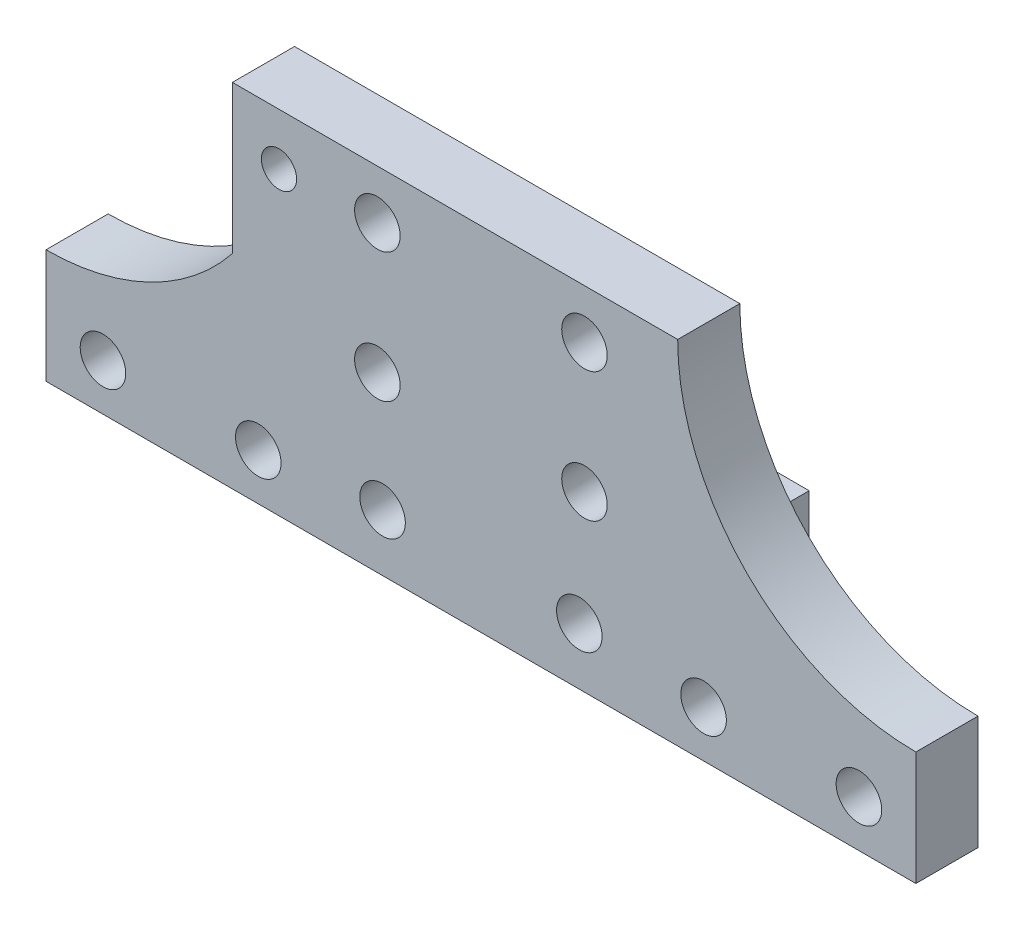
ISO-10303-21;
HEADER;
FILE_DESCRIPTION(('STEP AP214'),'2;1');
FILE_NAME('part.step','',(''),(''),'','','');
FILE_SCHEMA(('AUTOMOTIVE_DESIGN { 1 0 10303 214 1 1 1 1 }'));
ENDSEC;
DATA;
#1=APPLICATION_CONTEXT('core data for automotive mechanical design processes');
#2=APPLICATION_PROTOCOL_DEFINITION('international standard','automotive_design',2000,#1);
#3=PRODUCT_CONTEXT('',#1,'mechanical');
#4=PRODUCT('Part','Part','',(#3));
#5=PRODUCT_RELATED_PRODUCT_CATEGORY('part','',(#4));
#6=PRODUCT_DEFINITION_FORMATION('','',#4);
#7=PRODUCT_DEFINITION_CONTEXT('part definition',#1,'design');
#8=PRODUCT_DEFINITION('design','',#6,#7);
#9=PRODUCT_DEFINITION_SHAPE('','',#8);
#10=(LENGTH_UNIT() NAMED_UNIT(*) SI_UNIT(.MILLI.,.METRE.));
#11=(NAMED_UNIT(*) PLANE_ANGLE_UNIT() SI_UNIT($,.RADIAN.));
#12=(NAMED_UNIT(*) SI_UNIT($,.STERADIAN.) SOLID_ANGLE_UNIT());
#13=UNCERTAINTY_MEASURE_WITH_UNIT(LENGTH_MEASURE(1.E-05),#10,'distance_accuracy_value','');
#14=(GEOMETRIC_REPRESENTATION_CONTEXT(3) GLOBAL_UNCERTAINTY_ASSIGNED_CONTEXT((#13)) GLOBAL_UNIT_ASSIGNED_CONTEXT((#10,
#11,#12)) REPRESENTATION_CONTEXT('',''));
#15=CARTESIAN_POINT('',(0.,0.,0.));
#16=DIRECTION('',(0.,0.,1.));
#17=DIRECTION('',(1.,0.,0.));
#18=AXIS2_PLACEMENT_3D('',#15,#16,#17);
#19=CARTESIAN_POINT('',(15.5,29.5,-14.3));
#20=DIRECTION('',(0.,0.,-1.));
#21=DIRECTION('',(-1.,0.,0.));
#22=AXIS2_PLACEMENT_3D('',#19,#20,#21);
#23=PLANE('',#22);
#24=CARTESIAN_POINT('',(-16.4999999999999,12.25,-14.3));
#25=DIRECTION('',(0.,0.,-1.));
#26=DIRECTION('',(-1.,0.,0.));
#27=AXIS2_PLACEMENT_3D('',#24,#25,#26);
#28=CIRCLE('',#27,2.20000000000001);
#29=CARTESIAN_POINT('',(-18.6999999999999,12.25,-14.3));
#30=VERTEX_POINT('',#29);
#31=EDGE_CURVE('E233',#30,#30,#28,.T.);
#32=ORIENTED_EDGE('',*,*,#31,.F.);
#33=EDGE_LOOP('',(#32));
#34=FACE_BOUND('',#33,.T.);
#35=CARTESIAN_POINT('',(-16.4999999999999,24.75,-14.3));
#36=DIRECTION('',(0.,0.,-1.));
#37=DIRECTION('',(-1.,0.,0.));
#38=AXIS2_PLACEMENT_3D('',#35,#36,#37);
#39=CIRCLE('',#38,2.20000000000001);
#40=CARTESIAN_POINT('',(-18.6999999999999,24.75,-14.3));
#41=VERTEX_POINT('',#40);
#42=EDGE_CURVE('E215',#41,#41,#39,.T.);
#43=ORIENTED_EDGE('',*,*,#42,.F.);
#44=EDGE_LOOP('',(#43));
#45=FACE_BOUND('',#44,.T.);
#46=CARTESIAN_POINT('',(-5.,0.,-14.3));
#47=DIRECTION('',(0.,0.,-1.));
#48=DIRECTION('',(-1.,0.,0.));
#49=AXIS2_PLACEMENT_3D('',#46,#47,#48);
#50=CIRCLE('',#49,2.20000000000001);
#51=CARTESIAN_POINT('',(-7.20000000000002,0.,-14.3));
#52=VERTEX_POINT('',#51);
#53=EDGE_CURVE('E187',#52,#52,#50,.T.);
#54=ORIENTED_EDGE('',*,*,#53,.F.);
#55=EDGE_LOOP('',(#54));
#56=FACE_BOUND('',#55,.T.);
#57=CARTESIAN_POINT('',(9.99999999999999,0.,-14.3));
#58=DIRECTION('',(0.,0.,-1.));
#59=DIRECTION('',(-1.,0.,0.));
#60=AXIS2_PLACEMENT_3D('',#57,#58,#59);
#61=CIRCLE('',#60,2.20000000000001);
#62=CARTESIAN_POINT('',(7.79999999999997,0.,-14.3));
#63=VERTEX_POINT('',#62);
#64=EDGE_CURVE('E181',#63,#63,#61,.T.);
#65=ORIENTED_EDGE('',*,*,#64,.F.);
#66=EDGE_LOOP('',(#65));
#67=FACE_BOUND('',#66,.T.);
#68=DIRECTION('',(1.,0.,0.));
#69=VECTOR('',#68,1.);
#70=CARTESIAN_POINT('',(-11.4999999999999,6.5,-14.3));
#71=LINE('',#70,#69);
#72=CARTESIAN_POINT('',(-23.9999999999998,6.5,-14.3));
#73=VERTEX_POINT('',#72);
#74=CARTESIAN_POINT('',(-11.4999999999999,6.5,-14.3));
#75=VERTEX_POINT('',#74);
#76=EDGE_CURVE('E292',#73,#75,#71,.T.);
#77=ORIENTED_EDGE('',*,*,#76,.F.);
#78=DIRECTION('',(0.,1.,0.));
#79=VECTOR('',#78,1.);
#80=CARTESIAN_POINT('',(-23.9999999999998,29.5,-14.3));
#81=LINE('',#80,#79);
#82=CARTESIAN_POINT('',(-23.9999999999998,29.5,-14.3));
#83=VERTEX_POINT('',#82);
#84=EDGE_CURVE('E45',#73,#83,#81,.T.);
#85=ORIENTED_EDGE('',*,*,#84,.T.);
#86=DIRECTION('',(1.,0.,0.));
#87=VECTOR('',#86,1.);
#88=CARTESIAN_POINT('',(-68.5,29.5,-14.3));
#89=LINE('',#88,#87);
#90=CARTESIAN_POINT('',(-7.5,29.5,-14.3));
#91=VERTEX_POINT('',#90);
#92=EDGE_CURVE('E350',#83,#91,#89,.T.);
#93=ORIENTED_EDGE('',*,*,#92,.T.);
#94=CARTESIAN_POINT('',(15.5,29.5,-14.3));
#95=DIRECTION('',(0.,0.,-1.));
#96=DIRECTION('',(-1.,0.,0.));
#97=AXIS2_PLACEMENT_3D('',#94,#95,#96);
#98=CIRCLE('',#97,23.);
#99=CARTESIAN_POINT('',(15.5,6.49999999999998,-14.3));
#100=VERTEX_POINT('',#99);
#101=EDGE_CURVE('E240',#100,#91,#98,.T.);
#102=ORIENTED_EDGE('',*,*,#101,.F.);
#103=DIRECTION('',(0.,-1.,0.));
#104=VECTOR('',#103,1.);
#105=CARTESIAN_POINT('',(15.5,29.5,-14.3));
#106=LINE('',#105,#104);
#107=CARTESIAN_POINT('',(15.5,-4.5,-14.3));
#108=VERTEX_POINT('',#107);
#109=EDGE_CURVE('E320',#100,#108,#106,.T.);
#110=ORIENTED_EDGE('',*,*,#109,.T.);
#111=DIRECTION('',(-1.,0.,0.));
#112=VECTOR('',#111,1.);
#113=CARTESIAN_POINT('',(15.5,-4.5,-14.3));
#114=LINE('',#113,#112);
#115=CARTESIAN_POINT('',(-11.4999999999999,-4.5,-14.3));
#116=VERTEX_POINT('',#115);
#117=EDGE_CURVE('E319',#108,#116,#114,.T.);
#118=ORIENTED_EDGE('',*,*,#117,.T.);
#119=DIRECTION('',(0.,-1.,0.));
#120=VECTOR('',#119,1.);
#121=CARTESIAN_POINT('',(-11.4999999999999,-4.5,-14.3));
#122=LINE('',#121,#120);
#123=EDGE_CURVE('E257',#75,#116,#122,.T.);
#124=ORIENTED_EDGE('',*,*,#123,.F.);
#125=EDGE_LOOP('',(#77,#85,#93,#102,#110,#118,#124));
#126=FACE_BOUND('',#125,.T.);
#127=ADVANCED_FACE('F30',(#34,#45,#56,#67,#126),#23,.T.);
#128=CARTESIAN_POINT('',(-11.4999999999999,6.5,-25.0000000000001));
#129=DIRECTION('',(0.,-1.,0.));
#130=DIRECTION('',(0.,0.,-1.));
#131=AXIS2_PLACEMENT_3D('',#128,#129,#130);
#132=PLANE('',#131);
#133=CARTESIAN_POINT('',(-41.5000000000001,6.5,-14.3));
#134=VERTEX_POINT('',#133);
#135=CARTESIAN_POINT('',(-28.9999999999999,6.5,-14.3));
#136=VERTEX_POINT('',#135);
#137=EDGE_CURVE('E262',#134,#136,#71,.T.);
#138=ORIENTED_EDGE('',*,*,#137,.T.);
#139=DIRECTION('',(0.,0.,-1.));
#140=VECTOR('',#139,1.);
#141=CARTESIAN_POINT('',(-28.9999999999999,6.5,-25.0000000000001));
#142=LINE('',#141,#140);
#143=CARTESIAN_POINT('',(-28.9999999999999,6.5,-21.0000000000001));
#144=VERTEX_POINT('',#143);
#145=EDGE_CURVE('E158',#136,#144,#142,.T.);
#146=ORIENTED_EDGE('',*,*,#145,.T.);
#147=DIRECTION('',(1.,0.,0.));
#148=VECTOR('',#147,1.);
#149=CARTESIAN_POINT('',(-11.4999999999999,6.5,-21.0000000000001));
#150=LINE('',#149,#148);
#151=CARTESIAN_POINT('',(-26.4999999999999,6.50000000000001,-21.0000000000001));
#152=VERTEX_POINT('',#151);
#153=EDGE_CURVE('E157',#144,#152,#150,.T.);
#154=ORIENTED_EDGE('',*,*,#153,.T.);
#155=CARTESIAN_POINT('',(-26.4999999999999,6.5,-25.0000000000001));
#156=DIRECTION('',(0.,-1.,0.));
#157=DIRECTION('',(0.,0.,-1.));
#158=AXIS2_PLACEMENT_3D('',#155,#156,#157);
#159=CIRCLE('',#158,4.00000000000001);
#160=CARTESIAN_POINT('',(-30.4999999999999,6.5,-25.0000000000001));
#161=VERTEX_POINT('',#160);
#162=EDGE_CURVE('E179',#152,#161,#159,.T.);
#163=ORIENTED_EDGE('',*,*,#162,.T.);
#164=DIRECTION('',(1.,0.,0.));
#165=VECTOR('',#164,1.);
#166=CARTESIAN_POINT('',(-11.4999999999999,6.5,-25.0000000000001));
#167=LINE('',#166,#165);
#168=CARTESIAN_POINT('',(-41.5000000000001,6.5,-25.0000000000001));
#169=VERTEX_POINT('',#168);
#170=EDGE_CURVE('E269',#169,#161,#167,.T.);
#171=ORIENTED_EDGE('',*,*,#170,.F.);
#172=DIRECTION('',(0.,0.,1.));
#173=VECTOR('',#172,1.);
#174=CARTESIAN_POINT('',(-41.5000000000001,6.5,-25.0000000000001));
#175=LINE('',#174,#173);
#176=EDGE_CURVE('E295',#169,#134,#175,.T.);
#177=ORIENTED_EDGE('',*,*,#176,.T.);
#178=EDGE_LOOP('',(#138,#146,#154,#163,#171,#177));
#179=FACE_BOUND('',#178,.T.);
#180=ADVANCED_FACE('F402',(#179),#132,.F.);
#181=CARTESIAN_POINT('',(-11.4999999999999,6.5,-25.0000000000001));
#182=DIRECTION('',(0.,0.,1.));
#183=DIRECTION('',(1.,0.,0.));
#184=AXIS2_PLACEMENT_3D('',#181,#182,#183);
#185=PLANE('',#184);
#186=CARTESIAN_POINT('',(-35.9999999999999,1.00000000000003,-25.0000000000001));
#187=DIRECTION('',(0.,0.,-1.));
#188=DIRECTION('',(0.,1.,0.));
#189=AXIS2_PLACEMENT_3D('',#186,#187,#188);
#190=CIRCLE('',#189,2.20000000000001);
#191=CARTESIAN_POINT('',(-35.9999999999999,3.20000000000005,-25.0000000000001));
#192=VERTEX_POINT('',#191);
#193=EDGE_CURVE('E209',#192,#192,#190,.T.);
#194=ORIENTED_EDGE('',*,*,#193,.F.);
#195=EDGE_LOOP('',(#194));
#196=FACE_BOUND('',#195,.T.);
#197=ORIENTED_EDGE('',*,*,#170,.T.);
#198=DIRECTION('',(0.,-1.,0.));
#199=VECTOR('',#198,1.);
#200=CARTESIAN_POINT('',(-30.4999999999999,-4.5,-25.0000000000001));
#201=LINE('',#200,#199);
#202=CARTESIAN_POINT('',(-30.4999999999999,-4.5,-25.0000000000001));
#203=VERTEX_POINT('',#202);
#204=EDGE_CURVE('E11',#161,#203,#201,.T.);
#205=ORIENTED_EDGE('',*,*,#204,.T.);
#206=DIRECTION('',(-1.,0.,0.));
#207=VECTOR('',#206,1.);
#208=CARTESIAN_POINT('',(-41.5000000000001,-4.5,-25.0000000000001));
#209=LINE('',#208,#207);
#210=CARTESIAN_POINT('',(-41.5000000000001,-4.5,-25.0000000000001));
#211=VERTEX_POINT('',#210);
#212=EDGE_CURVE('E261',#203,#211,#209,.T.);
#213=ORIENTED_EDGE('',*,*,#212,.T.);
#214=DIRECTION('',(0.,1.,0.));
#215=VECTOR('',#214,1.);
#216=CARTESIAN_POINT('',(-41.5000000000001,6.5,-25.0000000000001));
#217=LINE('',#216,#215);
#218=EDGE_CURVE('E266',#211,#169,#217,.T.);
#219=ORIENTED_EDGE('',*,*,#218,.T.);
#220=EDGE_LOOP('',(#197,#205,#213,#219));
#221=FACE_BOUND('',#220,.T.);
#222=ADVANCED_FACE('F396',(#196,#221),#185,.F.);
#223=CARTESIAN_POINT('',(-68.5,29.5,-8.30000000000001));
#224=DIRECTION('',(0.,1.,0.));
#225=DIRECTION('',(0.,0.,1.));
#226=AXIS2_PLACEMENT_3D('',#223,#224,#225);
#227=PLANE('',#226);
#228=DIRECTION('',(1.,0.,0.));
#229=VECTOR('',#228,1.);
#230=CARTESIAN_POINT('',(-68.5,29.5,-8.30000000000001));
#231=LINE('',#230,#229);
#232=CARTESIAN_POINT('',(-50.4999999999997,29.5,-8.3));
#233=VERTEX_POINT('',#232);
#234=CARTESIAN_POINT('',(-7.5,29.5,-8.29999999999996));
#235=VERTEX_POINT('',#234);
#236=EDGE_CURVE('E330',#233,#235,#231,.T.);
#237=ORIENTED_EDGE('',*,*,#236,.T.);
#238=DIRECTION('',(0.,0.,-1.));
#239=VECTOR('',#238,1.);
#240=CARTESIAN_POINT('',(-7.5,29.5,-14.3));
#241=LINE('',#240,#239);
#242=EDGE_CURVE('E248',#91,#235,#241,.F.);
#243=ORIENTED_EDGE('',*,*,#242,.F.);
#244=ORIENTED_EDGE('',*,*,#92,.F.);
#245=DIRECTION('',(1.,0.,0.));
#246=VECTOR('',#245,1.);
#247=CARTESIAN_POINT('',(15.5,29.5,-14.3));
#248=LINE('',#247,#246);
#249=CARTESIAN_POINT('',(-28.9999999999999,29.5,-14.3));
#250=VERTEX_POINT('',#249);
#251=EDGE_CURVE('E168',#250,#83,#248,.T.);
#252=ORIENTED_EDGE('',*,*,#251,.F.);
#253=CARTESIAN_POINT('',(-50.4999999999997,29.5,-14.3));
#254=VERTEX_POINT('',#253);
#255=EDGE_CURVE('E348',#254,#250,#89,.T.);
#256=ORIENTED_EDGE('',*,*,#255,.F.);
#257=DIRECTION('',(0.,0.,1.));
#258=VECTOR('',#257,1.);
#259=CARTESIAN_POINT('',(-50.4999999999997,29.5,-14.3));
#260=LINE('',#259,#258);
#261=EDGE_CURVE('E354',#254,#233,#260,.T.);
#262=ORIENTED_EDGE('',*,*,#261,.T.);
#263=EDGE_LOOP('',(#237,#243,#244,#252,#256,#262));
#264=FACE_BOUND('',#263,.T.);
#265=ADVANCED_FACE('F32',(#264),#227,.T.);
#266=CARTESIAN_POINT('',(-68.5,-4.5,-8.30000000000001));
#267=DIRECTION('',(-1.,0.,0.));
#268=DIRECTION('',(0.,0.,1.));
#269=AXIS2_PLACEMENT_3D('',#266,#267,#268);
#270=PLANE('',#269);
#271=DIRECTION('',(0.,0.,1.));
#272=VECTOR('',#271,1.);
#273=CARTESIAN_POINT('',(-68.5,6.5,-14.3));
#274=LINE('',#273,#272);
#275=CARTESIAN_POINT('',(-68.5,6.5,-14.3));
#276=VERTEX_POINT('',#275);
#277=CARTESIAN_POINT('',(-68.5,6.5,-8.3));
#278=VERTEX_POINT('',#277);
#279=EDGE_CURVE('E361',#276,#278,#274,.T.);
#280=ORIENTED_EDGE('',*,*,#279,.F.);
#281=DIRECTION('',(0.,1.,0.));
#282=VECTOR('',#281,1.);
#283=CARTESIAN_POINT('',(-68.5,-4.5,-14.3));
#284=LINE('',#283,#282);
#285=CARTESIAN_POINT('',(-68.5,-4.5,-14.3));
#286=VERTEX_POINT('',#285);
#287=EDGE_CURVE('E326',#286,#276,#284,.T.);
#288=ORIENTED_EDGE('',*,*,#287,.F.);
#289=DIRECTION('',(0.,0.,-1.));
#290=VECTOR('',#289,1.);
#291=CARTESIAN_POINT('',(-68.5,-4.5,-8.30000000000001));
#292=LINE('',#291,#290);
#293=CARTESIAN_POINT('',(-68.5,-4.5,-8.30000000000001));
#294=VERTEX_POINT('',#293);
#295=EDGE_CURVE('E243',#294,#286,#292,.T.);
#296=ORIENTED_EDGE('',*,*,#295,.F.);
#297=DIRECTION('',(0.,1.,0.));
#298=VECTOR('',#297,1.);
#299=CARTESIAN_POINT('',(-68.5,-4.5,-8.30000000000001));
#300=LINE('',#299,#298);
#301=EDGE_CURVE('E334',#294,#278,#300,.T.);
#302=ORIENTED_EDGE('',*,*,#301,.T.);
#303=EDGE_LOOP('',(#280,#288,#296,#302));
#304=FACE_BOUND('',#303,.T.);
#305=ADVANCED_FACE('F384',(#304),#270,.T.);
#306=CARTESIAN_POINT('',(15.5,-4.5,-8.3));
#307=DIRECTION('',(0.,-1.,0.));
#308=DIRECTION('',(0.,0.,-1.));
#309=AXIS2_PLACEMENT_3D('',#306,#307,#308);
#310=PLANE('',#309);
#311=ORIENTED_EDGE('',*,*,#212,.F.);
#312=CARTESIAN_POINT('',(-26.4999999999999,-4.5,-25.0000000000001));
#313=DIRECTION('',(0.,-1.,0.));
#314=DIRECTION('',(0.,0.,-1.));
#315=AXIS2_PLACEMENT_3D('',#312,#313,#314);
#316=CIRCLE('',#315,4.00000000000001);
#317=CARTESIAN_POINT('',(-22.4999999999998,-4.5,-25.0000000000001));
#318=VERTEX_POINT('',#317);
#319=EDGE_CURVE('E177',#318,#203,#316,.T.);
#320=ORIENTED_EDGE('',*,*,#319,.F.);
#321=CARTESIAN_POINT('',(-11.4999999999999,-4.5,-25.0000000000001));
#322=VERTEX_POINT('',#321);
#323=EDGE_CURVE('E263',#322,#318,#209,.T.);
#324=ORIENTED_EDGE('',*,*,#323,.F.);
#325=DIRECTION('',(0.,0.,1.));
#326=VECTOR('',#325,1.);
#327=CARTESIAN_POINT('',(-11.4999999999999,-4.5,-25.0000000000001));
#328=LINE('',#327,#326);
#329=EDGE_CURVE('E299',#322,#116,#328,.T.);
#330=ORIENTED_EDGE('',*,*,#329,.T.);
#331=ORIENTED_EDGE('',*,*,#117,.F.);
#332=DIRECTION('',(0.,0.,-1.));
#333=VECTOR('',#332,1.);
#334=CARTESIAN_POINT('',(15.5,-4.5,-8.3));
#335=LINE('',#334,#333);
#336=CARTESIAN_POINT('',(15.5,-4.5,-8.3));
#337=VERTEX_POINT('',#336);
#338=EDGE_CURVE('E332',#337,#108,#335,.T.);
#339=ORIENTED_EDGE('',*,*,#338,.F.);
#340=DIRECTION('',(-1.,0.,0.));
#341=VECTOR('',#340,1.);
#342=CARTESIAN_POINT('',(15.5,-4.5,-8.3));
#343=LINE('',#342,#341);
#344=EDGE_CURVE('E339',#337,#294,#343,.T.);
#345=ORIENTED_EDGE('',*,*,#344,.T.);
#346=ORIENTED_EDGE('',*,*,#295,.T.);
#347=CARTESIAN_POINT('',(-41.5000000000001,-4.5,-14.3));
#348=VERTEX_POINT('',#347);
#349=EDGE_CURVE('E316',#348,#286,#114,.T.);
#350=ORIENTED_EDGE('',*,*,#349,.F.);
#351=DIRECTION('',(0.,0.,1.));
#352=VECTOR('',#351,1.);
#353=CARTESIAN_POINT('',(-41.5000000000001,-4.5,-25.0000000000001));
#354=LINE('',#353,#352);
#355=EDGE_CURVE('E303',#211,#348,#354,.T.);
#356=ORIENTED_EDGE('',*,*,#355,.F.);
#357=EDGE_LOOP('',(#311,#320,#324,#330,#331,#339,#345,#346,#350,#356));
#358=FACE_BOUND('',#357,.T.);
#359=ADVANCED_FACE('F373',(#358),#310,.T.);
#360=CARTESIAN_POINT('',(15.5,29.5,-8.3));
#361=DIRECTION('',(1.,0.,0.));
#362=DIRECTION('',(0.,0.,-1.));
#363=AXIS2_PLACEMENT_3D('',#360,#361,#362);
#364=PLANE('',#363);
#365=DIRECTION('',(0.,0.,-1.));
#366=VECTOR('',#365,1.);
#367=CARTESIAN_POINT('',(15.5,6.49999999999998,-14.3));
#368=LINE('',#367,#366);
#369=CARTESIAN_POINT('',(15.5,6.49999999999998,-8.29999999999996));
#370=VERTEX_POINT('',#369);
#371=EDGE_CURVE('E246',#370,#100,#368,.T.);
#372=ORIENTED_EDGE('',*,*,#371,.F.);
#373=DIRECTION('',(0.,-1.,0.));
#374=VECTOR('',#373,1.);
#375=CARTESIAN_POINT('',(15.5,29.5,-8.3));
#376=LINE('',#375,#374);
#377=EDGE_CURVE('E345',#370,#337,#376,.T.);
#378=ORIENTED_EDGE('',*,*,#377,.T.);
#379=ORIENTED_EDGE('',*,*,#338,.T.);
#380=ORIENTED_EDGE('',*,*,#109,.F.);
#381=EDGE_LOOP('',(#372,#378,#379,#380));
#382=FACE_BOUND('',#381,.T.);
#383=ADVANCED_FACE('F369',(#382),#364,.T.);
#384=CARTESIAN_POINT('',(15.5,29.5,-8.3));
#385=DIRECTION('',(0.,0.,-1.));
#386=DIRECTION('',(-1.,0.,0.));
#387=AXIS2_PLACEMENT_3D('',#384,#385,#386);
#388=PLANE('',#387);
#389=CARTESIAN_POINT('',(-62.9999999999997,0.,-8.29999999999989));
#390=DIRECTION('',(0.,0.,-1.));
#391=DIRECTION('',(-1.,0.,0.));
#392=AXIS2_PLACEMENT_3D('',#389,#390,#391);
#393=CIRCLE('',#392,2.20000000000001);
#394=CARTESIAN_POINT('',(-65.1999999999997,0.,-8.29999999999989));
#395=VERTEX_POINT('',#394);
#396=EDGE_CURVE('E200',#395,#395,#393,.T.);
#397=ORIENTED_EDGE('',*,*,#396,.T.);
#398=EDGE_LOOP('',(#397));
#399=FACE_BOUND('',#398,.T.);
#400=CARTESIAN_POINT('',(-47.9999999999997,0.,-8.29999999999989));
#401=DIRECTION('',(0.,0.,-1.));
#402=DIRECTION('',(-1.,0.,0.));
#403=AXIS2_PLACEMENT_3D('',#400,#401,#402);
#404=CIRCLE('',#403,2.20000000000001);
#405=CARTESIAN_POINT('',(-50.1999999999997,0.,-8.29999999999989));
#406=VERTEX_POINT('',#405);
#407=EDGE_CURVE('E206',#406,#406,#404,.T.);
#408=ORIENTED_EDGE('',*,*,#407,.T.);
#409=EDGE_LOOP('',(#408));
#410=FACE_BOUND('',#409,.T.);
#411=CARTESIAN_POINT('',(-35.9999999999999,1.00000000000005,-8.29999999999988));
#412=DIRECTION('',(0.,0.,-1.));
#413=DIRECTION('',(0.,1.,0.));
#414=AXIS2_PLACEMENT_3D('',#411,#412,#413);
#415=CIRCLE('',#414,2.20000000000001);
#416=CARTESIAN_POINT('',(-35.9999999999999,3.20000000000007,-8.29999999999988));
#417=VERTEX_POINT('',#416);
#418=EDGE_CURVE('E212',#417,#417,#415,.T.);
#419=ORIENTED_EDGE('',*,*,#418,.T.);
#420=EDGE_LOOP('',(#419));
#421=FACE_BOUND('',#420,.T.);
#422=CARTESIAN_POINT('',(-36.4999999999999,24.75,-8.29999999999994));
#423=DIRECTION('',(0.,0.,-1.));
#424=DIRECTION('',(-1.,0.,0.));
#425=AXIS2_PLACEMENT_3D('',#422,#423,#424);
#426=CIRCLE('',#425,2.20000000000001);
#427=CARTESIAN_POINT('',(-38.6999999999999,24.75,-8.29999999999994));
#428=VERTEX_POINT('',#427);
#429=EDGE_CURVE('E224',#428,#428,#426,.T.);
#430=ORIENTED_EDGE('',*,*,#429,.T.);
#431=EDGE_LOOP('',(#430));
#432=FACE_BOUND('',#431,.T.);
#433=CARTESIAN_POINT('',(-36.4999999999999,12.25,-8.29999999999994));
#434=DIRECTION('',(0.,0.,-1.));
#435=DIRECTION('',(-1.,0.,0.));
#436=AXIS2_PLACEMENT_3D('',#433,#434,#435);
#437=CIRCLE('',#436,2.20000000000001);
#438=CARTESIAN_POINT('',(-38.6999999999999,12.25,-8.29999999999994));
#439=VERTEX_POINT('',#438);
#440=EDGE_CURVE('E230',#439,#439,#437,.T.);
#441=ORIENTED_EDGE('',*,*,#440,.T.);
#442=EDGE_LOOP('',(#441));
#443=FACE_BOUND('',#442,.T.);
#444=CARTESIAN_POINT('',(-45.9999999999999,24.5,-8.29999999999997));
#445=DIRECTION('',(0.,0.,-1.));
#446=DIRECTION('',(-1.,0.,0.));
#447=AXIS2_PLACEMENT_3D('',#444,#445,#446);
#448=CIRCLE('',#447,1.70000000000001);
#449=CARTESIAN_POINT('',(-47.6999999999999,24.5,-8.29999999999997));
#450=VERTEX_POINT('',#449);
#451=EDGE_CURVE('E254',#450,#450,#448,.T.);
#452=ORIENTED_EDGE('',*,*,#451,.T.);
#453=EDGE_LOOP('',(#452));
#454=FACE_BOUND('',#453,.T.);
#455=ORIENTED_EDGE('',*,*,#301,.F.);
#456=ORIENTED_EDGE('',*,*,#344,.F.);
#457=ORIENTED_EDGE('',*,*,#377,.F.);
#458=CARTESIAN_POINT('',(15.5,29.5,-8.29999999999996));
#459=DIRECTION('',(0.,0.,-1.));
#460=DIRECTION('',(-1.,0.,0.));
#461=AXIS2_PLACEMENT_3D('',#458,#459,#460);
#462=CIRCLE('',#461,23.);
#463=EDGE_CURVE('E239',#370,#235,#462,.T.);
#464=ORIENTED_EDGE('',*,*,#463,.T.);
#465=ORIENTED_EDGE('',*,*,#236,.F.);
#466=DIRECTION('',(0.,1.,0.));
#467=VECTOR('',#466,1.);
#468=CARTESIAN_POINT('',(-50.4999999999997,15.1821789367237,-8.3));
#469=LINE('',#468,#467);
#470=CARTESIAN_POINT('',(-50.4999999999998,15.1821789367238,-8.3));
#471=VERTEX_POINT('',#470);
#472=EDGE_CURVE('E305',#471,#233,#469,.T.);
#473=ORIENTED_EDGE('',*,*,#472,.F.);
#474=CARTESIAN_POINT('',(-68.5,29.5,-8.3));
#475=DIRECTION('',(0.,0.,1.));
#476=DIRECTION('',(1.,0.,0.));
#477=AXIS2_PLACEMENT_3D('',#474,#475,#476);
#478=CIRCLE('',#477,23.0000000000001);
#479=EDGE_CURVE('E302',#278,#471,#478,.T.);
#480=ORIENTED_EDGE('',*,*,#479,.F.);
#481=EDGE_LOOP('',(#455,#456,#457,#464,#465,#473,#480));
#482=FACE_BOUND('',#481,.T.);
#483=CARTESIAN_POINT('',(-16.4999999999999,12.25,-8.29999999999995));
#484=DIRECTION('',(0.,0.,-1.));
#485=DIRECTION('',(-1.,0.,0.));
#486=AXIS2_PLACEMENT_3D('',#483,#484,#485);
#487=CIRCLE('',#486,2.20000000000001);
#488=CARTESIAN_POINT('',(-18.6999999999999,12.25,-8.29999999999995));
#489=VERTEX_POINT('',#488);
#490=EDGE_CURVE('E236',#489,#489,#487,.T.);
#491=ORIENTED_EDGE('',*,*,#490,.T.);
#492=EDGE_LOOP('',(#491));
#493=FACE_BOUND('',#492,.T.);
#494=CARTESIAN_POINT('',(-16.4999999999999,24.75,-8.29999999999994));
#495=DIRECTION('',(0.,0.,-1.));
#496=DIRECTION('',(-1.,0.,0.));
#497=AXIS2_PLACEMENT_3D('',#494,#495,#496);
#498=CIRCLE('',#497,2.20000000000001);
#499=CARTESIAN_POINT('',(-18.6999999999999,24.75,-8.29999999999994));
#500=VERTEX_POINT('',#499);
#501=EDGE_CURVE('E218',#500,#500,#498,.T.);
#502=ORIENTED_EDGE('',*,*,#501,.T.);
#503=EDGE_LOOP('',(#502));
#504=FACE_BOUND('',#503,.T.);
#505=CARTESIAN_POINT('',(-16.9999999999999,1.,-8.3));
#506=DIRECTION('',(0.,0.,1.));
#507=DIRECTION('',(1.,0.,0.));
#508=AXIS2_PLACEMENT_3D('',#505,#506,#507);
#509=CIRCLE('',#508,2.20000000000001);
#510=CARTESIAN_POINT('',(-14.7999999999998,1.,-8.3));
#511=VERTEX_POINT('',#510);
#512=EDGE_CURVE('E193',#511,#511,#509,.T.);
#513=ORIENTED_EDGE('',*,*,#512,.F.);
#514=EDGE_LOOP('',(#513));
#515=FACE_BOUND('',#514,.T.);
#516=CARTESIAN_POINT('',(-5.,0.,-8.29999999999988));
#517=DIRECTION('',(0.,0.,-1.));
#518=DIRECTION('',(-1.,0.,0.));
#519=AXIS2_PLACEMENT_3D('',#516,#517,#518);
#520=CIRCLE('',#519,2.20000000000001);
#521=CARTESIAN_POINT('',(-7.20000000000002,0.,-8.29999999999988));
#522=VERTEX_POINT('',#521);
#523=EDGE_CURVE('E190',#522,#522,#520,.T.);
#524=ORIENTED_EDGE('',*,*,#523,.T.);
#525=EDGE_LOOP('',(#524));
#526=FACE_BOUND('',#525,.T.);
#527=CARTESIAN_POINT('',(9.99999999999999,0.,-8.29999999999987));
#528=DIRECTION('',(0.,0.,-1.));
#529=DIRECTION('',(-1.,0.,0.));
#530=AXIS2_PLACEMENT_3D('',#527,#528,#529);
#531=CIRCLE('',#530,2.20000000000001);
#532=CARTESIAN_POINT('',(7.79999999999997,0.,-8.29999999999987));
#533=VERTEX_POINT('',#532);
#534=EDGE_CURVE('E184',#533,#533,#531,.T.);
#535=ORIENTED_EDGE('',*,*,#534,.T.);
#536=EDGE_LOOP('',(#535));
#537=FACE_BOUND('',#536,.T.);
#538=ADVANCED_FACE('F374',(#399,#410,#421,#432,#443,#454,#482,#493,#504,#515,#526,#537),#388,.F.);
#539=DIRECTION('',(0.,1.,0.));
#540=VECTOR('',#539,1.);
#541=CARTESIAN_POINT('',(-28.9999999999999,29.5,-14.3));
#542=LINE('',#541,#540);
#543=EDGE_CURVE('E53',#136,#250,#542,.T.);
#544=ORIENTED_EDGE('',*,*,#543,.F.);
#545=ORIENTED_EDGE('',*,*,#137,.F.);
#546=DIRECTION('',(0.,1.,0.));
#547=VECTOR('',#546,1.);
#548=CARTESIAN_POINT('',(-41.5000000000001,6.5,-14.3));
#549=LINE('',#548,#547);
#550=EDGE_CURVE('E280',#348,#134,#549,.T.);
#551=ORIENTED_EDGE('',*,*,#550,.F.);
#552=ORIENTED_EDGE('',*,*,#349,.T.);
#553=ORIENTED_EDGE('',*,*,#287,.T.);
#554=CARTESIAN_POINT('',(-68.5,29.5,-14.3));
#555=DIRECTION('',(0.,0.,1.));
#556=DIRECTION('',(1.,0.,0.));
#557=AXIS2_PLACEMENT_3D('',#554,#555,#556);
#558=CIRCLE('',#557,23.0000000000001);
#559=CARTESIAN_POINT('',(-50.4999999999998,15.1821789367238,-14.3));
#560=VERTEX_POINT('',#559);
#561=EDGE_CURVE('E382',#276,#560,#558,.T.);
#562=ORIENTED_EDGE('',*,*,#561,.T.);
#563=DIRECTION('',(0.,1.,0.));
#564=VECTOR('',#563,1.);
#565=CARTESIAN_POINT('',(-50.4999999999997,15.1821789367237,-14.3));
#566=LINE('',#565,#564);
#567=EDGE_CURVE('E366',#560,#254,#566,.T.);
#568=ORIENTED_EDGE('',*,*,#567,.T.);
#569=ORIENTED_EDGE('',*,*,#255,.T.);
#570=EDGE_LOOP('',(#544,#545,#551,#552,#553,#562,#568,#569));
#571=FACE_BOUND('',#570,.T.);
#572=CARTESIAN_POINT('',(-62.9999999999997,0.,-14.3));
#573=DIRECTION('',(0.,0.,-1.));
#574=DIRECTION('',(-1.,0.,0.));
#575=AXIS2_PLACEMENT_3D('',#572,#573,#574);
#576=CIRCLE('',#575,2.20000000000001);
#577=CARTESIAN_POINT('',(-65.1999999999997,0.,-14.3));
#578=VERTEX_POINT('',#577);
#579=EDGE_CURVE('E197',#578,#578,#576,.T.);
#580=ORIENTED_EDGE('',*,*,#579,.F.);
#581=EDGE_LOOP('',(#580));
#582=FACE_BOUND('',#581,.T.);
#583=CARTESIAN_POINT('',(-47.9999999999997,0.,-14.3));
#584=DIRECTION('',(0.,0.,-1.));
#585=DIRECTION('',(-1.,0.,0.));
#586=AXIS2_PLACEMENT_3D('',#583,#584,#585);
#587=CIRCLE('',#586,2.20000000000001);
#588=CARTESIAN_POINT('',(-50.1999999999997,0.,-14.3));
#589=VERTEX_POINT('',#588);
#590=EDGE_CURVE('E203',#589,#589,#587,.T.);
#591=ORIENTED_EDGE('',*,*,#590,.F.);
#592=EDGE_LOOP('',(#591));
#593=FACE_BOUND('',#592,.T.);
#594=CARTESIAN_POINT('',(-36.4999999999999,24.75,-14.3));
#595=DIRECTION('',(0.,0.,-1.));
#596=DIRECTION('',(-1.,0.,0.));
#597=AXIS2_PLACEMENT_3D('',#594,#595,#596);
#598=CIRCLE('',#597,2.20000000000001);
#599=CARTESIAN_POINT('',(-38.6999999999999,24.75,-14.3));
#600=VERTEX_POINT('',#599);
#601=EDGE_CURVE('E221',#600,#600,#598,.T.);
#602=ORIENTED_EDGE('',*,*,#601,.F.);
#603=EDGE_LOOP('',(#602));
#604=FACE_BOUND('',#603,.T.);
#605=CARTESIAN_POINT('',(-36.4999999999999,12.25,-14.3));
#606=DIRECTION('',(0.,0.,-1.));
#607=DIRECTION('',(-1.,0.,0.));
#608=AXIS2_PLACEMENT_3D('',#605,#606,#607);
#609=CIRCLE('',#608,2.20000000000001);
#610=CARTESIAN_POINT('',(-38.6999999999999,12.25,-14.3));
#611=VERTEX_POINT('',#610);
#612=EDGE_CURVE('E227',#611,#611,#609,.T.);
#613=ORIENTED_EDGE('',*,*,#612,.F.);
#614=EDGE_LOOP('',(#613));
#615=FACE_BOUND('',#614,.T.);
#616=CARTESIAN_POINT('',(-45.9999999999999,24.5,-14.3));
#617=DIRECTION('',(0.,0.,-1.));
#618=DIRECTION('',(-1.,0.,0.));
#619=AXIS2_PLACEMENT_3D('',#616,#617,#618);
#620=CIRCLE('',#619,1.70000000000001);
#621=CARTESIAN_POINT('',(-47.6999999999999,24.5,-14.3));
#622=VERTEX_POINT('',#621);
#623=EDGE_CURVE('E251',#622,#622,#620,.T.);
#624=ORIENTED_EDGE('',*,*,#623,.F.);
#625=EDGE_LOOP('',(#624));
#626=FACE_BOUND('',#625,.T.);
#627=ADVANCED_FACE('F385',(#571,#582,#593,#604,#615,#626),#23,.T.);
#628=CARTESIAN_POINT('',(-50.4999999999997,15.1821789367237,-14.3));
#629=DIRECTION('',(1.,0.,0.));
#630=DIRECTION('',(0.,0.,-1.));
#631=AXIS2_PLACEMENT_3D('',#628,#629,#630);
#632=PLANE('',#631);
#633=ORIENTED_EDGE('',*,*,#472,.T.);
#634=ORIENTED_EDGE('',*,*,#261,.F.);
#635=ORIENTED_EDGE('',*,*,#567,.F.);
#636=DIRECTION('',(0.,0.,1.));
#637=VECTOR('',#636,1.);
#638=CARTESIAN_POINT('',(-50.4999999999998,15.1821789367238,-14.3));
#639=LINE('',#638,#637);
#640=EDGE_CURVE('E357',#560,#471,#639,.T.);
#641=ORIENTED_EDGE('',*,*,#640,.T.);
#642=EDGE_LOOP('',(#633,#634,#635,#641));
#643=FACE_BOUND('',#642,.T.);
#644=ADVANCED_FACE('F424',(#643),#632,.F.);
#645=CARTESIAN_POINT('',(-68.5,29.5,-14.3));
#646=DIRECTION('',(0.,0.,1.));
#647=DIRECTION('',(1.,0.,0.));
#648=AXIS2_PLACEMENT_3D('',#645,#646,#647);
#649=CYLINDRICAL_SURFACE('',#648,23.0000000000001);
#650=ORIENTED_EDGE('',*,*,#479,.T.);
#651=ORIENTED_EDGE('',*,*,#640,.F.);
#652=ORIENTED_EDGE('',*,*,#561,.F.);
#653=ORIENTED_EDGE('',*,*,#279,.T.);
#654=EDGE_LOOP('',(#650,#651,#652,#653));
#655=FACE_BOUND('',#654,.T.);
#656=ADVANCED_FACE('F380',(#655),#649,.F.);
#657=CARTESIAN_POINT('',(-11.4999999999999,-4.5,-25.0000000000001));
#658=DIRECTION('',(-1.,0.,0.));
#659=DIRECTION('',(0.,0.,1.));
#660=AXIS2_PLACEMENT_3D('',#657,#658,#659);
#661=PLANE('',#660);
#662=ORIENTED_EDGE('',*,*,#123,.T.);
#663=ORIENTED_EDGE('',*,*,#329,.F.);
#664=DIRECTION('',(0.,-1.,0.));
#665=VECTOR('',#664,1.);
#666=CARTESIAN_POINT('',(-11.4999999999999,-4.5,-25.0000000000001));
#667=LINE('',#666,#665);
#668=CARTESIAN_POINT('',(-11.4999999999999,6.5,-25.0000000000001));
#669=VERTEX_POINT('',#668);
#670=EDGE_CURVE('E258',#669,#322,#667,.T.);
#671=ORIENTED_EDGE('',*,*,#670,.F.);
#672=DIRECTION('',(0.,0.,1.));
#673=VECTOR('',#672,1.);
#674=CARTESIAN_POINT('',(-11.4999999999999,6.5,-25.0000000000001));
#675=LINE('',#674,#673);
#676=EDGE_CURVE('E272',#669,#75,#675,.T.);
#677=ORIENTED_EDGE('',*,*,#676,.T.);
#678=EDGE_LOOP('',(#662,#663,#671,#677));
#679=FACE_BOUND('',#678,.T.);
#680=ADVANCED_FACE('F297',(#679),#661,.F.);
#681=CARTESIAN_POINT('',(-41.5000000000001,6.5,-25.0000000000001));
#682=DIRECTION('',(1.,0.,0.));
#683=DIRECTION('',(0.,0.,-1.));
#684=AXIS2_PLACEMENT_3D('',#681,#682,#683);
#685=PLANE('',#684);
#686=ORIENTED_EDGE('',*,*,#550,.T.);
#687=ORIENTED_EDGE('',*,*,#176,.F.);
#688=ORIENTED_EDGE('',*,*,#218,.F.);
#689=ORIENTED_EDGE('',*,*,#355,.T.);
#690=EDGE_LOOP('',(#686,#687,#688,#689));
#691=FACE_BOUND('',#690,.T.);
#692=ADVANCED_FACE('F391',(#691),#685,.F.);
#693=CARTESIAN_POINT('',(-22.4999999999998,6.5,-25.0000000000001));
#694=VERTEX_POINT('',#693);
#695=EDGE_CURVE('E153',#694,#152,#159,.T.);
#696=ORIENTED_EDGE('',*,*,#695,.T.);
#697=CARTESIAN_POINT('',(-23.9999999999998,6.5,-21.0000000000001));
#698=VERTEX_POINT('',#697);
#699=EDGE_CURVE('E148',#152,#698,#150,.T.);
#700=ORIENTED_EDGE('',*,*,#699,.T.);
#701=DIRECTION('',(0.,0.,-1.));
#702=VECTOR('',#701,1.);
#703=CARTESIAN_POINT('',(-23.9999999999998,6.5,-25.0000000000001));
#704=LINE('',#703,#702);
#705=EDGE_CURVE('E151',#73,#698,#704,.T.);
#706=ORIENTED_EDGE('',*,*,#705,.F.);
#707=ORIENTED_EDGE('',*,*,#76,.T.);
#708=ORIENTED_EDGE('',*,*,#676,.F.);
#709=EDGE_CURVE('E268',#694,#669,#167,.T.);
#710=ORIENTED_EDGE('',*,*,#709,.F.);
#711=EDGE_LOOP('',(#696,#700,#706,#707,#708,#710));
#712=FACE_BOUND('',#711,.T.);
#713=ADVANCED_FACE('F150',(#712),#132,.F.);
#714=CARTESIAN_POINT('',(-16.9999999999999,1.,-25.0000000000001));
#715=DIRECTION('',(0.,0.,1.));
#716=DIRECTION('',(1.,0.,0.));
#717=AXIS2_PLACEMENT_3D('',#714,#715,#716);
#718=CIRCLE('',#717,2.20000000000001);
#719=CARTESIAN_POINT('',(-14.7999999999998,1.,-25.0000000000001));
#720=VERTEX_POINT('',#719);
#721=EDGE_CURVE('E196',#720,#720,#718,.T.);
#722=ORIENTED_EDGE('',*,*,#721,.T.);
#723=EDGE_LOOP('',(#722));
#724=FACE_BOUND('',#723,.T.);
#725=ORIENTED_EDGE('',*,*,#323,.T.);
#726=DIRECTION('',(0.,-1.,0.));
#727=VECTOR('',#726,1.);
#728=CARTESIAN_POINT('',(-22.4999999999998,-4.5,-25.0000000000001));
#729=LINE('',#728,#727);
#730=EDGE_CURVE('E38',#318,#694,#729,.F.);
#731=ORIENTED_EDGE('',*,*,#730,.T.);
#732=ORIENTED_EDGE('',*,*,#709,.T.);
#733=ORIENTED_EDGE('',*,*,#670,.T.);
#734=EDGE_LOOP('',(#725,#731,#732,#733));
#735=FACE_BOUND('',#734,.T.);
#736=ADVANCED_FACE('F286',(#724,#735),#185,.F.);
#737=CARTESIAN_POINT('',(-45.9999999999999,24.5,-14.3));
#738=DIRECTION('',(0.,0.,-1.));
#739=DIRECTION('',(-1.,0.,0.));
#740=AXIS2_PLACEMENT_3D('',#737,#738,#739);
#741=CYLINDRICAL_SURFACE('',#740,1.70000000000001);
#742=ORIENTED_EDGE('',*,*,#451,.F.);
#743=EDGE_LOOP('',(#742));
#744=FACE_BOUND('',#743,.T.);
#745=ORIENTED_EDGE('',*,*,#623,.T.);
#746=EDGE_LOOP('',(#745));
#747=FACE_BOUND('',#746,.T.);
#748=ADVANCED_FACE('F446',(#744,#747),#741,.F.);
#749=CARTESIAN_POINT('',(15.5,29.5,-14.3));
#750=DIRECTION('',(0.,0.,-1.));
#751=DIRECTION('',(-1.,0.,0.));
#752=AXIS2_PLACEMENT_3D('',#749,#750,#751);
#753=CYLINDRICAL_SURFACE('',#752,23.);
#754=ORIENTED_EDGE('',*,*,#242,.T.);
#755=ORIENTED_EDGE('',*,*,#463,.F.);
#756=ORIENTED_EDGE('',*,*,#371,.T.);
#757=ORIENTED_EDGE('',*,*,#101,.T.);
#758=EDGE_LOOP('',(#754,#755,#756,#757));
#759=FACE_BOUND('',#758,.T.);
#760=ADVANCED_FACE('F450',(#759),#753,.F.);
#761=CARTESIAN_POINT('',(-16.4999999999999,12.25,-14.3));
#762=DIRECTION('',(0.,0.,-1.));
#763=DIRECTION('',(-1.,0.,0.));
#764=AXIS2_PLACEMENT_3D('',#761,#762,#763);
#765=CYLINDRICAL_SURFACE('',#764,2.20000000000001);
#766=ORIENTED_EDGE('',*,*,#490,.F.);
#767=EDGE_LOOP('',(#766));
#768=FACE_BOUND('',#767,.T.);
#769=ORIENTED_EDGE('',*,*,#31,.T.);
#770=EDGE_LOOP('',(#769));
#771=FACE_BOUND('',#770,.T.);
#772=ADVANCED_FACE('F454',(#768,#771),#765,.F.);
#773=CARTESIAN_POINT('',(-36.4999999999999,12.25,-14.3));
#774=DIRECTION('',(0.,0.,-1.));
#775=DIRECTION('',(-1.,0.,0.));
#776=AXIS2_PLACEMENT_3D('',#773,#774,#775);
#777=CYLINDRICAL_SURFACE('',#776,2.20000000000001);
#778=ORIENTED_EDGE('',*,*,#440,.F.);
#779=EDGE_LOOP('',(#778));
#780=FACE_BOUND('',#779,.T.);
#781=ORIENTED_EDGE('',*,*,#612,.T.);
#782=EDGE_LOOP('',(#781));
#783=FACE_BOUND('',#782,.T.);
#784=ADVANCED_FACE('F458',(#780,#783),#777,.F.);
#785=CARTESIAN_POINT('',(-36.4999999999999,24.75,-14.3));
#786=DIRECTION('',(0.,0.,-1.));
#787=DIRECTION('',(-1.,0.,0.));
#788=AXIS2_PLACEMENT_3D('',#785,#786,#787);
#789=CYLINDRICAL_SURFACE('',#788,2.20000000000001);
#790=ORIENTED_EDGE('',*,*,#429,.F.);
#791=EDGE_LOOP('',(#790));
#792=FACE_BOUND('',#791,.T.);
#793=ORIENTED_EDGE('',*,*,#601,.T.);
#794=EDGE_LOOP('',(#793));
#795=FACE_BOUND('',#794,.T.);
#796=ADVANCED_FACE('F462',(#792,#795),#789,.F.);
#797=CARTESIAN_POINT('',(-16.4999999999999,24.75,-14.3));
#798=DIRECTION('',(0.,0.,-1.));
#799=DIRECTION('',(-1.,0.,0.));
#800=AXIS2_PLACEMENT_3D('',#797,#798,#799);
#801=CYLINDRICAL_SURFACE('',#800,2.20000000000001);
#802=ORIENTED_EDGE('',*,*,#501,.F.);
#803=EDGE_LOOP('',(#802));
#804=FACE_BOUND('',#803,.T.);
#805=ORIENTED_EDGE('',*,*,#42,.T.);
#806=EDGE_LOOP('',(#805));
#807=FACE_BOUND('',#806,.T.);
#808=ADVANCED_FACE('F466',(#804,#807),#801,.F.);
#809=CARTESIAN_POINT('',(-35.9999999999999,1.00000000000003,-25.0000000000001));
#810=DIRECTION('',(0.,0.,-1.));
#811=DIRECTION('',(0.,1.,0.));
#812=AXIS2_PLACEMENT_3D('',#809,#810,#811);
#813=CYLINDRICAL_SURFACE('',#812,2.20000000000001);
#814=ORIENTED_EDGE('',*,*,#418,.F.);
#815=EDGE_LOOP('',(#814));
#816=FACE_BOUND('',#815,.T.);
#817=ORIENTED_EDGE('',*,*,#193,.T.);
#818=EDGE_LOOP('',(#817));
#819=FACE_BOUND('',#818,.T.);
#820=ADVANCED_FACE('F470',(#816,#819),#813,.F.);
#821=CARTESIAN_POINT('',(-47.9999999999997,0.,-14.3));
#822=DIRECTION('',(0.,0.,-1.));
#823=DIRECTION('',(-1.,0.,0.));
#824=AXIS2_PLACEMENT_3D('',#821,#822,#823);
#825=CYLINDRICAL_SURFACE('',#824,2.20000000000001);
#826=ORIENTED_EDGE('',*,*,#407,.F.);
#827=EDGE_LOOP('',(#826));
#828=FACE_BOUND('',#827,.T.);
#829=ORIENTED_EDGE('',*,*,#590,.T.);
#830=EDGE_LOOP('',(#829));
#831=FACE_BOUND('',#830,.T.);
#832=ADVANCED_FACE('F474',(#828,#831),#825,.F.);
#833=CARTESIAN_POINT('',(-62.9999999999997,0.,-14.3));
#834=DIRECTION('',(0.,0.,-1.));
#835=DIRECTION('',(-1.,0.,0.));
#836=AXIS2_PLACEMENT_3D('',#833,#834,#835);
#837=CYLINDRICAL_SURFACE('',#836,2.20000000000001);
#838=ORIENTED_EDGE('',*,*,#396,.F.);
#839=EDGE_LOOP('',(#838));
#840=FACE_BOUND('',#839,.T.);
#841=ORIENTED_EDGE('',*,*,#579,.T.);
#842=EDGE_LOOP('',(#841));
#843=FACE_BOUND('',#842,.T.);
#844=ADVANCED_FACE('F478',(#840,#843),#837,.F.);
#845=CARTESIAN_POINT('',(-16.9999999999999,1.,-8.3));
#846=DIRECTION('',(0.,0.,1.));
#847=DIRECTION('',(1.,0.,0.));
#848=AXIS2_PLACEMENT_3D('',#845,#846,#847);
#849=CYLINDRICAL_SURFACE('',#848,2.20000000000001);
#850=ORIENTED_EDGE('',*,*,#512,.T.);
#851=EDGE_LOOP('',(#850));
#852=FACE_BOUND('',#851,.T.);
#853=ORIENTED_EDGE('',*,*,#721,.F.);
#854=EDGE_LOOP('',(#853));
#855=FACE_BOUND('',#854,.T.);
#856=ADVANCED_FACE('F482',(#852,#855),#849,.F.);
#857=CARTESIAN_POINT('',(-5.,0.,-14.3));
#858=DIRECTION('',(0.,0.,-1.));
#859=DIRECTION('',(-1.,0.,0.));
#860=AXIS2_PLACEMENT_3D('',#857,#858,#859);
#861=CYLINDRICAL_SURFACE('',#860,2.20000000000001);
#862=ORIENTED_EDGE('',*,*,#523,.F.);
#863=EDGE_LOOP('',(#862));
#864=FACE_BOUND('',#863,.T.);
#865=ORIENTED_EDGE('',*,*,#53,.T.);
#866=EDGE_LOOP('',(#865));
#867=FACE_BOUND('',#866,.T.);
#868=ADVANCED_FACE('F486',(#864,#867),#861,.F.);
#869=CARTESIAN_POINT('',(9.99999999999999,0.,-14.3));
#870=DIRECTION('',(0.,0.,-1.));
#871=DIRECTION('',(-1.,0.,0.));
#872=AXIS2_PLACEMENT_3D('',#869,#870,#871);
#873=CYLINDRICAL_SURFACE('',#872,2.20000000000001);
#874=ORIENTED_EDGE('',*,*,#534,.F.);
#875=EDGE_LOOP('',(#874));
#876=FACE_BOUND('',#875,.T.);
#877=ORIENTED_EDGE('',*,*,#64,.T.);
#878=EDGE_LOOP('',(#877));
#879=FACE_BOUND('',#878,.T.);
#880=ADVANCED_FACE('F490',(#876,#879),#873,.F.);
#881=CARTESIAN_POINT('',(-26.4999999999999,-4.5,-25.0000000000001));
#882=DIRECTION('',(0.,-1.,0.));
#883=DIRECTION('',(0.,0.,-1.));
#884=AXIS2_PLACEMENT_3D('',#881,#882,#883);
#885=CYLINDRICAL_SURFACE('',#884,4.00000000000001);
#886=ORIENTED_EDGE('',*,*,#162,.F.);
#887=ORIENTED_EDGE('',*,*,#695,.F.);
#888=ORIENTED_EDGE('',*,*,#730,.F.);
#889=ORIENTED_EDGE('',*,*,#319,.T.);
#890=ORIENTED_EDGE('',*,*,#204,.F.);
#891=EDGE_LOOP('',(#886,#887,#888,#889,#890));
#892=FACE_BOUND('',#891,.T.);
#893=ADVANCED_FACE('F399',(#892),#885,.F.);
#894=CARTESIAN_POINT('',(-26.4999999999999,29.5,-14.3));
#895=DIRECTION('',(0.,0.279679396660933,-0.960093451224086));
#896=DIRECTION('',(0.,-0.960093451224086,-0.279679396660933));
#897=AXIS2_PLACEMENT_3D('',#894,#895,#896);
#898=PLANE('',#897);
#899=DIRECTION('',(0.,-0.960093451224086,-0.279679396660933));
#900=VECTOR('',#899,1.);
#901=CARTESIAN_POINT('',(-28.9999999999999,29.5,-14.3));
#902=LINE('',#901,#900);
#903=EDGE_CURVE('E169',#250,#144,#902,.T.);
#904=ORIENTED_EDGE('',*,*,#903,.F.);
#905=ORIENTED_EDGE('',*,*,#251,.T.);
#906=DIRECTION('',(0.,-0.960093451224086,-0.279679396660933));
#907=VECTOR('',#906,1.);
#908=CARTESIAN_POINT('',(-23.9999999999998,29.5,-14.3));
#909=LINE('',#908,#907);
#910=EDGE_CURVE('E163',#83,#698,#909,.T.);
#911=ORIENTED_EDGE('',*,*,#910,.T.);
#912=ORIENTED_EDGE('',*,*,#699,.F.);
#913=ORIENTED_EDGE('',*,*,#153,.F.);
#914=EDGE_LOOP('',(#904,#905,#911,#912,#913));
#915=FACE_BOUND('',#914,.T.);
#916=ADVANCED_FACE('F167',(#915),#898,.T.);
#917=CARTESIAN_POINT('',(-28.9999999999999,12.499975,-16.6500125));
#918=DIRECTION('',(-1.,0.,0.));
#919=DIRECTION('',(0.,0.,1.));
#920=AXIS2_PLACEMENT_3D('',#917,#918,#919);
#921=PLANE('',#920);
#922=ORIENTED_EDGE('',*,*,#543,.T.);
#923=ORIENTED_EDGE('',*,*,#903,.T.);
#924=ORIENTED_EDGE('',*,*,#145,.F.);
#925=EDGE_LOOP('',(#922,#923,#924));
#926=FACE_BOUND('',#925,.T.);
#927=ADVANCED_FACE('F403',(#926),#921,.T.);
#928=CARTESIAN_POINT('',(-23.9999999999998,12.499975,-16.6500125));
#929=DIRECTION('',(-1.,0.,0.));
#930=DIRECTION('',(0.,0.,1.));
#931=AXIS2_PLACEMENT_3D('',#928,#929,#930);
#932=PLANE('',#931);
#933=ORIENTED_EDGE('',*,*,#84,.F.);
#934=ORIENTED_EDGE('',*,*,#705,.T.);
#935=ORIENTED_EDGE('',*,*,#910,.F.);
#936=EDGE_LOOP('',(#933,#934,#935));
#937=FACE_BOUND('',#936,.T.);
#938=ADVANCED_FACE('F162',(#937),#932,.F.);
#939=CLOSED_SHELL('',(#127,#180,#222,#265,#305,#359,#383,#538,#627,#644,#656,#680,#692,#713,
#736,#748,#760,#772,#784,#796,#808,#820,#832,#844,#856,#868,#880,#893,#916,#927,#938));
#940=MANIFOLD_SOLID_BREP('B2',#939);
#941=ADVANCED_BREP_SHAPE_REPRESENTATION('',(#18,#940),#14);
#942=SHAPE_DEFINITION_REPRESENTATION(#9,#941);
ENDSEC;
END-ISO-10303-21;
